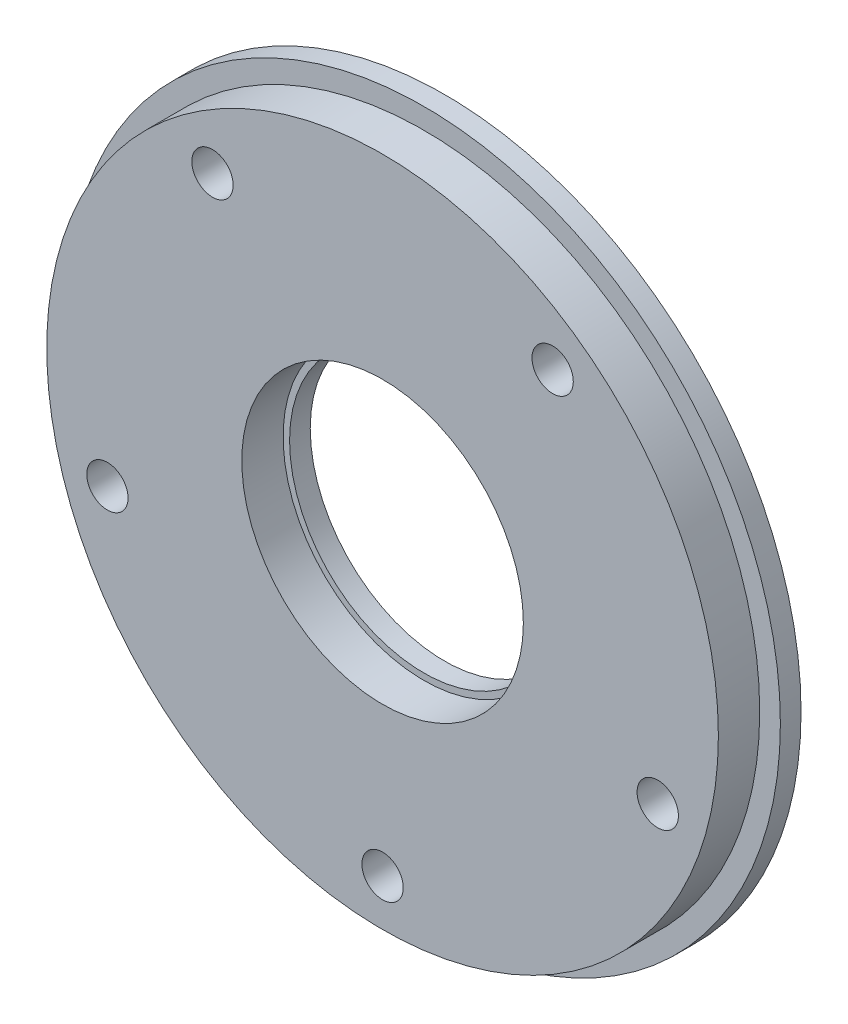
ISO-10303-21;
HEADER;
FILE_DESCRIPTION(('STEP AP214'),'2;1');
FILE_NAME('part.step','',(''),(''),'','','');
FILE_SCHEMA(('AUTOMOTIVE_DESIGN { 1 0 10303 214 1 1 1 1 }'));
ENDSEC;
DATA;
#1=APPLICATION_CONTEXT('core data for automotive mechanical design processes');
#2=APPLICATION_PROTOCOL_DEFINITION('international standard','automotive_design',2000,#1);
#3=PRODUCT_CONTEXT('',#1,'mechanical');
#4=PRODUCT('Part','Part','',(#3));
#5=PRODUCT_RELATED_PRODUCT_CATEGORY('part','',(#4));
#6=PRODUCT_DEFINITION_FORMATION('','',#4);
#7=PRODUCT_DEFINITION_CONTEXT('part definition',#1,'design');
#8=PRODUCT_DEFINITION('design','',#6,#7);
#9=PRODUCT_DEFINITION_SHAPE('','',#8);
#10=(LENGTH_UNIT() NAMED_UNIT(*) SI_UNIT(.MILLI.,.METRE.));
#11=(NAMED_UNIT(*) PLANE_ANGLE_UNIT() SI_UNIT($,.RADIAN.));
#12=(NAMED_UNIT(*) SI_UNIT($,.STERADIAN.) SOLID_ANGLE_UNIT());
#13=UNCERTAINTY_MEASURE_WITH_UNIT(LENGTH_MEASURE(1.E-05),#10,'distance_accuracy_value','');
#14=(GEOMETRIC_REPRESENTATION_CONTEXT(3) GLOBAL_UNCERTAINTY_ASSIGNED_CONTEXT((#13)) GLOBAL_UNIT_ASSIGNED_CONTEXT((#10,
#11,#12)) REPRESENTATION_CONTEXT('',''));
#15=CARTESIAN_POINT('',(0.,0.,0.));
#16=DIRECTION('',(0.,0.,1.));
#17=DIRECTION('',(1.,0.,0.));
#18=AXIS2_PLACEMENT_3D('',#15,#16,#17);
#19=CARTESIAN_POINT('',(0.,0.,2.));
#20=DIRECTION('',(0.,0.,1.));
#21=DIRECTION('',(1.,0.,0.));
#22=AXIS2_PLACEMENT_3D('',#19,#20,#21);
#23=PLANE('',#22);
#24=CARTESIAN_POINT('',(0.,0.,2.));
#25=DIRECTION('',(0.,0.,1.));
#26=DIRECTION('',(1.,0.,0.));
#27=AXIS2_PLACEMENT_3D('',#24,#25,#26);
#28=CIRCLE('',#27,13.);
#29=CARTESIAN_POINT('',(13.,0.,2.));
#30=VERTEX_POINT('',#29);
#31=EDGE_CURVE('E67',#30,#30,#28,.T.);
#32=ORIENTED_EDGE('',*,*,#31,.F.);
#33=EDGE_LOOP('',(#32));
#34=FACE_BOUND('',#33,.T.);
#35=CARTESIAN_POINT('',(0.,0.,2.));
#36=DIRECTION('',(0.,0.,1.));
#37=DIRECTION('',(1.,0.,0.));
#38=AXIS2_PLACEMENT_3D('',#35,#36,#37);
#39=CIRCLE('',#38,13.625);
#40=CARTESIAN_POINT('',(13.625,0.,2.));
#41=VERTEX_POINT('',#40);
#42=EDGE_CURVE('E214',#41,#41,#39,.T.);
#43=ORIENTED_EDGE('',*,*,#42,.T.);
#44=EDGE_LOOP('',(#43));
#45=FACE_BOUND('',#44,.T.);
#46=ADVANCED_FACE('F34',(#34,#45),#23,.T.);
#47=CARTESIAN_POINT('',(0.,0.,2.));
#48=DIRECTION('',(0.,0.,1.));
#49=DIRECTION('',(1.,0.,0.));
#50=AXIS2_PLACEMENT_3D('',#47,#48,#49);
#51=CIRCLE('',#50,32.5);
#52=CARTESIAN_POINT('',(32.5,0.,2.));
#53=VERTEX_POINT('',#52);
#54=EDGE_CURVE('E10',#53,#53,#51,.T.);
#55=ORIENTED_EDGE('',*,*,#54,.F.);
#56=EDGE_LOOP('',(#55));
#57=FACE_BOUND('',#56,.T.);
#58=CARTESIAN_POINT('',(0.,0.,2.));
#59=DIRECTION('',(0.,0.,1.));
#60=DIRECTION('',(1.,0.,0.));
#61=AXIS2_PLACEMENT_3D('',#58,#59,#60);
#62=CIRCLE('',#61,34.5);
#63=CARTESIAN_POINT('',(34.5,0.,2.));
#64=VERTEX_POINT('',#63);
#65=EDGE_CURVE('E42',#64,#64,#62,.T.);
#66=ORIENTED_EDGE('',*,*,#65,.T.);
#67=EDGE_LOOP('',(#66));
#68=FACE_BOUND('',#67,.T.);
#69=ADVANCED_FACE('F91',(#57,#68),#23,.T.);
#70=CARTESIAN_POINT('',(0.,0.,0.));
#71=DIRECTION('',(0.,0.,1.));
#72=DIRECTION('',(1.,0.,0.));
#73=AXIS2_PLACEMENT_3D('',#70,#71,#72);
#74=PLANE('',#73);
#75=CARTESIAN_POINT('',(0.,0.,0.));
#76=DIRECTION('',(0.,0.,1.));
#77=DIRECTION('',(1.,0.,0.));
#78=AXIS2_PLACEMENT_3D('',#75,#76,#77);
#79=CIRCLE('',#78,34.5);
#80=CARTESIAN_POINT('',(34.5,0.,0.));
#81=VERTEX_POINT('',#80);
#82=EDGE_CURVE('E38',#81,#81,#79,.T.);
#83=ORIENTED_EDGE('',*,*,#82,.F.);
#84=EDGE_LOOP('',(#83));
#85=FACE_BOUND('',#84,.T.);
#86=CARTESIAN_POINT('',(0.,0.,0.));
#87=DIRECTION('',(0.,0.,1.));
#88=DIRECTION('',(1.,0.,0.));
#89=AXIS2_PLACEMENT_3D('',#86,#87,#88);
#90=CIRCLE('',#89,13.);
#91=CARTESIAN_POINT('',(13.,0.,0.));
#92=VERTEX_POINT('',#91);
#93=EDGE_CURVE('E66',#92,#92,#90,.T.);
#94=ORIENTED_EDGE('',*,*,#93,.T.);
#95=EDGE_LOOP('',(#94));
#96=FACE_BOUND('',#95,.T.);
#97=CARTESIAN_POINT('',(0.,-28.,0.));
#98=DIRECTION('',(0.,0.,1.));
#99=DIRECTION('',(1.,0.,0.));
#100=AXIS2_PLACEMENT_3D('',#97,#98,#99);
#101=CIRCLE('',#100,2.);
#102=CARTESIAN_POINT('',(2.,-28.,0.));
#103=VERTEX_POINT('',#102);
#104=EDGE_CURVE('E63',#103,#103,#101,.T.);
#105=ORIENTED_EDGE('',*,*,#104,.T.);
#106=EDGE_LOOP('',(#105));
#107=FACE_BOUND('',#106,.T.);
#108=CARTESIAN_POINT('',(-26.6295824562643,-8.65247584249846,0.));
#109=DIRECTION('',(0.,0.,1.));
#110=DIRECTION('',(1.,0.,0.));
#111=AXIS2_PLACEMENT_3D('',#108,#109,#110);
#112=CIRCLE('',#111,2.);
#113=CARTESIAN_POINT('',(-24.6295824562643,-8.65247584249846,0.));
#114=VERTEX_POINT('',#113);
#115=EDGE_CURVE('E60',#114,#114,#112,.T.);
#116=ORIENTED_EDGE('',*,*,#115,.T.);
#117=EDGE_LOOP('',(#116));
#118=FACE_BOUND('',#117,.T.);
#119=CARTESIAN_POINT('',(-16.4579870641891,22.6524758424986,0.));
#120=DIRECTION('',(0.,0.,1.));
#121=DIRECTION('',(1.,0.,0.));
#122=AXIS2_PLACEMENT_3D('',#119,#120,#121);
#123=CIRCLE('',#122,2.);
#124=CARTESIAN_POINT('',(-14.4579870641891,22.6524758424986,0.));
#125=VERTEX_POINT('',#124);
#126=EDGE_CURVE('E57',#125,#125,#123,.T.);
#127=ORIENTED_EDGE('',*,*,#126,.T.);
#128=EDGE_LOOP('',(#127));
#129=FACE_BOUND('',#128,.T.);
#130=CARTESIAN_POINT('',(16.4579870641894,22.6524758424984,0.));
#131=DIRECTION('',(0.,0.,1.));
#132=DIRECTION('',(1.,0.,0.));
#133=AXIS2_PLACEMENT_3D('',#130,#131,#132);
#134=CIRCLE('',#133,2.);
#135=CARTESIAN_POINT('',(18.4579870641894,22.6524758424984,0.));
#136=VERTEX_POINT('',#135);
#137=EDGE_CURVE('E54',#136,#136,#134,.T.);
#138=ORIENTED_EDGE('',*,*,#137,.T.);
#139=EDGE_LOOP('',(#138));
#140=FACE_BOUND('',#139,.T.);
#141=CARTESIAN_POINT('',(26.6295824562642,-8.65247584249883,0.));
#142=DIRECTION('',(0.,0.,1.));
#143=DIRECTION('',(1.,0.,0.));
#144=AXIS2_PLACEMENT_3D('',#141,#142,#143);
#145=CIRCLE('',#144,2.);
#146=CARTESIAN_POINT('',(28.6295824562642,-8.65247584249883,0.));
#147=VERTEX_POINT('',#146);
#148=EDGE_CURVE('E51',#147,#147,#145,.T.);
#149=ORIENTED_EDGE('',*,*,#148,.T.);
#150=EDGE_LOOP('',(#149));
#151=FACE_BOUND('',#150,.T.);
#152=ADVANCED_FACE('F73',(#85,#96,#107,#118,#129,#140,#151),#74,.F.);
#153=CARTESIAN_POINT('',(0.,0.,2.));
#154=DIRECTION('',(0.,0.,-1.));
#155=DIRECTION('',(-1.,0.,0.));
#156=AXIS2_PLACEMENT_3D('',#153,#154,#155);
#157=CYLINDRICAL_SURFACE('',#156,34.5);
#158=ORIENTED_EDGE('',*,*,#65,.F.);
#159=EDGE_LOOP('',(#158));
#160=FACE_BOUND('',#159,.T.);
#161=ORIENTED_EDGE('',*,*,#82,.T.);
#162=EDGE_LOOP('',(#161));
#163=FACE_BOUND('',#162,.T.);
#164=ADVANCED_FACE('F36',(#160,#163),#157,.T.);
#165=CARTESIAN_POINT('',(0.,0.,2.));
#166=DIRECTION('',(0.,0.,-1.));
#167=DIRECTION('',(-1.,0.,0.));
#168=AXIS2_PLACEMENT_3D('',#165,#166,#167);
#169=CYLINDRICAL_SURFACE('',#168,13.);
#170=ORIENTED_EDGE('',*,*,#31,.T.);
#171=EDGE_LOOP('',(#170));
#172=FACE_BOUND('',#171,.T.);
#173=ORIENTED_EDGE('',*,*,#93,.F.);
#174=EDGE_LOOP('',(#173));
#175=FACE_BOUND('',#174,.T.);
#176=ADVANCED_FACE('F76',(#172,#175),#169,.F.);
#177=CARTESIAN_POINT('',(0.,-28.,2.));
#178=DIRECTION('',(0.,0.,-1.));
#179=DIRECTION('',(-1.,0.,0.));
#180=AXIS2_PLACEMENT_3D('',#177,#178,#179);
#181=CYLINDRICAL_SURFACE('',#180,2.);
#182=ORIENTED_EDGE('',*,*,#104,.F.);
#183=EDGE_LOOP('',(#182));
#184=FACE_BOUND('',#183,.T.);
#185=CARTESIAN_POINT('',(0.,-28.,6.));
#186=DIRECTION('',(0.,0.,1.));
#187=DIRECTION('',(1.,0.,0.));
#188=AXIS2_PLACEMENT_3D('',#185,#186,#187);
#189=CIRCLE('',#188,2.);
#190=CARTESIAN_POINT('',(2.,-28.,6.));
#191=VERTEX_POINT('',#190);
#192=EDGE_CURVE('E215',#191,#191,#189,.T.);
#193=ORIENTED_EDGE('',*,*,#192,.T.);
#194=EDGE_LOOP('',(#193));
#195=FACE_BOUND('',#194,.T.);
#196=ADVANCED_FACE('F78',(#184,#195),#181,.F.);
#197=CARTESIAN_POINT('',(-26.6295824562643,-8.65247584249846,2.));
#198=DIRECTION('',(0.,0.,-1.));
#199=DIRECTION('',(-1.,0.,0.));
#200=AXIS2_PLACEMENT_3D('',#197,#198,#199);
#201=CYLINDRICAL_SURFACE('',#200,2.);
#202=ORIENTED_EDGE('',*,*,#115,.F.);
#203=EDGE_LOOP('',(#202));
#204=FACE_BOUND('',#203,.T.);
#205=CARTESIAN_POINT('',(-26.6295824562643,-8.65247584249846,6.));
#206=DIRECTION('',(0.,0.,1.));
#207=DIRECTION('',(1.,0.,0.));
#208=AXIS2_PLACEMENT_3D('',#205,#206,#207);
#209=CIRCLE('',#208,2.);
#210=CARTESIAN_POINT('',(-24.6295824562643,-8.65247584249846,6.));
#211=VERTEX_POINT('',#210);
#212=EDGE_CURVE('E218',#211,#211,#209,.T.);
#213=ORIENTED_EDGE('',*,*,#212,.T.);
#214=EDGE_LOOP('',(#213));
#215=FACE_BOUND('',#214,.T.);
#216=ADVANCED_FACE('F85',(#204,#215),#201,.F.);
#217=CARTESIAN_POINT('',(-16.4579870641891,22.6524758424986,2.));
#218=DIRECTION('',(0.,0.,-1.));
#219=DIRECTION('',(-1.,0.,0.));
#220=AXIS2_PLACEMENT_3D('',#217,#218,#219);
#221=CYLINDRICAL_SURFACE('',#220,2.);
#222=ORIENTED_EDGE('',*,*,#126,.F.);
#223=EDGE_LOOP('',(#222));
#224=FACE_BOUND('',#223,.T.);
#225=CARTESIAN_POINT('',(-16.4579870641891,22.6524758424986,6.));
#226=DIRECTION('',(0.,0.,1.));
#227=DIRECTION('',(1.,0.,0.));
#228=AXIS2_PLACEMENT_3D('',#225,#226,#227);
#229=CIRCLE('',#228,2.);
#230=CARTESIAN_POINT('',(-14.4579870641891,22.6524758424986,6.));
#231=VERTEX_POINT('',#230);
#232=EDGE_CURVE('E223',#231,#231,#229,.T.);
#233=ORIENTED_EDGE('',*,*,#232,.T.);
#234=EDGE_LOOP('',(#233));
#235=FACE_BOUND('',#234,.T.);
#236=ADVANCED_FACE('F141',(#224,#235),#221,.F.);
#237=CARTESIAN_POINT('',(16.4579870641894,22.6524758424984,2.));
#238=DIRECTION('',(0.,0.,-1.));
#239=DIRECTION('',(-1.,0.,0.));
#240=AXIS2_PLACEMENT_3D('',#237,#238,#239);
#241=CYLINDRICAL_SURFACE('',#240,2.);
#242=ORIENTED_EDGE('',*,*,#137,.F.);
#243=EDGE_LOOP('',(#242));
#244=FACE_BOUND('',#243,.T.);
#245=CARTESIAN_POINT('',(16.4579870641894,22.6524758424984,6.));
#246=DIRECTION('',(0.,0.,1.));
#247=DIRECTION('',(1.,0.,0.));
#248=AXIS2_PLACEMENT_3D('',#245,#246,#247);
#249=CIRCLE('',#248,2.);
#250=CARTESIAN_POINT('',(18.4579870641894,22.6524758424984,6.));
#251=VERTEX_POINT('',#250);
#252=EDGE_CURVE('E226',#251,#251,#249,.T.);
#253=ORIENTED_EDGE('',*,*,#252,.T.);
#254=EDGE_LOOP('',(#253));
#255=FACE_BOUND('',#254,.T.);
#256=ADVANCED_FACE('F152',(#244,#255),#241,.F.);
#257=CARTESIAN_POINT('',(26.6295824562642,-8.65247584249883,2.));
#258=DIRECTION('',(0.,0.,-1.));
#259=DIRECTION('',(-1.,0.,0.));
#260=AXIS2_PLACEMENT_3D('',#257,#258,#259);
#261=CYLINDRICAL_SURFACE('',#260,2.);
#262=ORIENTED_EDGE('',*,*,#148,.F.);
#263=EDGE_LOOP('',(#262));
#264=FACE_BOUND('',#263,.T.);
#265=CARTESIAN_POINT('',(26.6295824562642,-8.65247584249883,6.));
#266=DIRECTION('',(0.,0.,1.));
#267=DIRECTION('',(1.,0.,0.));
#268=AXIS2_PLACEMENT_3D('',#265,#266,#267);
#269=CIRCLE('',#268,2.);
#270=CARTESIAN_POINT('',(28.6295824562642,-8.65247584249883,6.));
#271=VERTEX_POINT('',#270);
#272=EDGE_CURVE('E229',#271,#271,#269,.T.);
#273=ORIENTED_EDGE('',*,*,#272,.T.);
#274=EDGE_LOOP('',(#273));
#275=FACE_BOUND('',#274,.T.);
#276=ADVANCED_FACE('F163',(#264,#275),#261,.F.);
#277=CARTESIAN_POINT('',(0.,0.,6.));
#278=DIRECTION('',(0.,0.,1.));
#279=DIRECTION('',(1.,0.,0.));
#280=AXIS2_PLACEMENT_3D('',#277,#278,#279);
#281=PLANE('',#280);
#282=ORIENTED_EDGE('',*,*,#252,.F.);
#283=EDGE_LOOP('',(#282));
#284=FACE_BOUND('',#283,.T.);
#285=ORIENTED_EDGE('',*,*,#212,.F.);
#286=EDGE_LOOP('',(#285));
#287=FACE_BOUND('',#286,.T.);
#288=CARTESIAN_POINT('',(0.,0.,6.));
#289=DIRECTION('',(0.,0.,1.));
#290=DIRECTION('',(1.,0.,0.));
#291=AXIS2_PLACEMENT_3D('',#288,#289,#290);
#292=CIRCLE('',#291,13.625);
#293=CARTESIAN_POINT('',(13.625,0.,6.));
#294=VERTEX_POINT('',#293);
#295=EDGE_CURVE('E211',#294,#294,#292,.T.);
#296=ORIENTED_EDGE('',*,*,#295,.F.);
#297=EDGE_LOOP('',(#296));
#298=FACE_BOUND('',#297,.T.);
#299=CARTESIAN_POINT('',(0.,0.,6.));
#300=DIRECTION('',(0.,0.,1.));
#301=DIRECTION('',(1.,0.,0.));
#302=AXIS2_PLACEMENT_3D('',#299,#300,#301);
#303=CIRCLE('',#302,32.5);
#304=CARTESIAN_POINT('',(32.5,0.,6.));
#305=VERTEX_POINT('',#304);
#306=EDGE_CURVE('E49',#305,#305,#303,.T.);
#307=ORIENTED_EDGE('',*,*,#306,.T.);
#308=EDGE_LOOP('',(#307));
#309=FACE_BOUND('',#308,.T.);
#310=ORIENTED_EDGE('',*,*,#192,.F.);
#311=EDGE_LOOP('',(#310));
#312=FACE_BOUND('',#311,.T.);
#313=ORIENTED_EDGE('',*,*,#232,.F.);
#314=EDGE_LOOP('',(#313));
#315=FACE_BOUND('',#314,.T.);
#316=ORIENTED_EDGE('',*,*,#272,.F.);
#317=EDGE_LOOP('',(#316));
#318=FACE_BOUND('',#317,.T.);
#319=ADVANCED_FACE('F174',(#284,#287,#298,#309,#312,#315,#318),#281,.T.);
#320=CARTESIAN_POINT('',(0.,0.,6.));
#321=DIRECTION('',(0.,0.,-1.));
#322=DIRECTION('',(-1.,0.,0.));
#323=AXIS2_PLACEMENT_3D('',#320,#321,#322);
#324=CYLINDRICAL_SURFACE('',#323,32.5);
#325=ORIENTED_EDGE('',*,*,#306,.F.);
#326=EDGE_LOOP('',(#325));
#327=FACE_BOUND('',#326,.T.);
#328=ORIENTED_EDGE('',*,*,#54,.T.);
#329=EDGE_LOOP('',(#328));
#330=FACE_BOUND('',#329,.T.);
#331=ADVANCED_FACE('F184',(#327,#330),#324,.T.);
#332=CARTESIAN_POINT('',(0.,0.,6.));
#333=DIRECTION('',(0.,0.,-1.));
#334=DIRECTION('',(-1.,0.,0.));
#335=AXIS2_PLACEMENT_3D('',#332,#333,#334);
#336=CYLINDRICAL_SURFACE('',#335,13.625);
#337=ORIENTED_EDGE('',*,*,#295,.T.);
#338=EDGE_LOOP('',(#337));
#339=FACE_BOUND('',#338,.T.);
#340=ORIENTED_EDGE('',*,*,#42,.F.);
#341=EDGE_LOOP('',(#340));
#342=FACE_BOUND('',#341,.T.);
#343=ADVANCED_FACE('F194',(#339,#342),#336,.F.);
#344=CLOSED_SHELL('',(#46,#69,#152,#164,#176,#196,#216,#236,#256,#276,#319,#331,#343));
#345=MANIFOLD_SOLID_BREP('B2',#344);
#346=ADVANCED_BREP_SHAPE_REPRESENTATION('',(#18,#345),#14);
#347=SHAPE_DEFINITION_REPRESENTATION(#9,#346);
ENDSEC;
END-ISO-10303-21;
